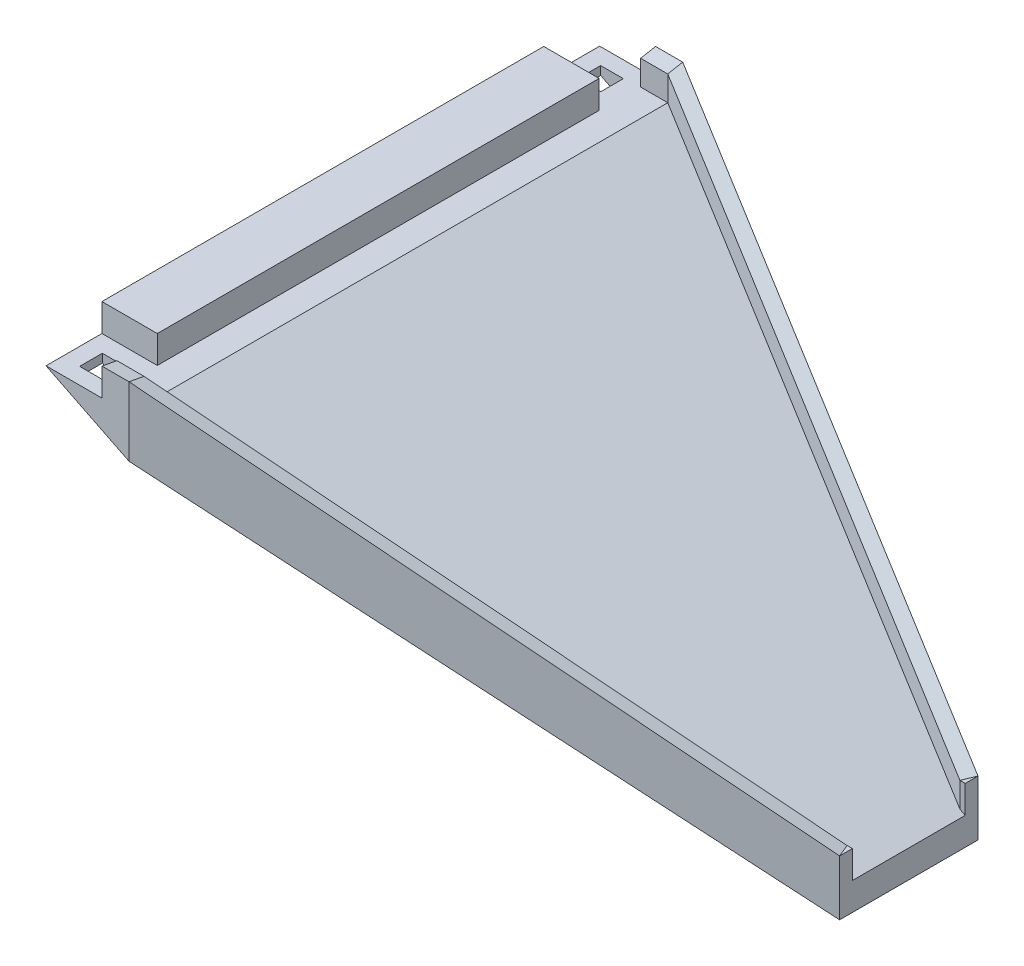
ISO-10303-21;
HEADER;
FILE_DESCRIPTION(('STEP AP214'),'2;1');
FILE_NAME('part.step','',(''),(''),'','','');
FILE_SCHEMA(('AUTOMOTIVE_DESIGN { 1 0 10303 214 1 1 1 1 }'));
ENDSEC;
DATA;
#1=APPLICATION_CONTEXT('core data for automotive mechanical design processes');
#2=APPLICATION_PROTOCOL_DEFINITION('international standard','automotive_design',2000,#1);
#3=PRODUCT_CONTEXT('',#1,'mechanical');
#4=PRODUCT('Part','Part','',(#3));
#5=PRODUCT_RELATED_PRODUCT_CATEGORY('part','',(#4));
#6=PRODUCT_DEFINITION_FORMATION('','',#4);
#7=PRODUCT_DEFINITION_CONTEXT('part definition',#1,'design');
#8=PRODUCT_DEFINITION('design','',#6,#7);
#9=PRODUCT_DEFINITION_SHAPE('','',#8);
#10=(LENGTH_UNIT() NAMED_UNIT(*) SI_UNIT(.MILLI.,.METRE.));
#11=(NAMED_UNIT(*) PLANE_ANGLE_UNIT() SI_UNIT($,.RADIAN.));
#12=(NAMED_UNIT(*) SI_UNIT($,.STERADIAN.) SOLID_ANGLE_UNIT());
#13=UNCERTAINTY_MEASURE_WITH_UNIT(LENGTH_MEASURE(1.E-05),#10,'distance_accuracy_value','');
#14=(GEOMETRIC_REPRESENTATION_CONTEXT(3) GLOBAL_UNCERTAINTY_ASSIGNED_CONTEXT((#13)) GLOBAL_UNIT_ASSIGNED_CONTEXT((#10,
#11,#12)) REPRESENTATION_CONTEXT('',''));
#15=CARTESIAN_POINT('',(0.,0.,0.));
#16=DIRECTION('',(0.,0.,1.));
#17=DIRECTION('',(1.,0.,0.));
#18=AXIS2_PLACEMENT_3D('',#15,#16,#17);
#19=CARTESIAN_POINT('',(34.2730049033685,100.,200.));
#20=DIRECTION('',(0.,-1.,0.));
#21=DIRECTION('',(0.,0.,-1.));
#22=AXIS2_PLACEMENT_3D('',#19,#20,#21);
#23=PLANE('',#22);
#24=DIRECTION('',(0.,0.,1.));
#25=VECTOR('',#24,1.);
#26=CARTESIAN_POINT('',(18.7230049033685,100.,185.9));
#27=LINE('',#26,#25);
#28=CARTESIAN_POINT('',(18.7230049033685,100.,185.9));
#29=VERTEX_POINT('',#28);
#30=CARTESIAN_POINT('',(18.7230049033685,100.,194.1));
#31=VERTEX_POINT('',#30);
#32=EDGE_CURVE('E264',#29,#31,#27,.T.);
#33=ORIENTED_EDGE('',*,*,#32,.T.);
#34=DIRECTION('',(-1.,0.,0.));
#35=VECTOR('',#34,1.);
#36=CARTESIAN_POINT('',(10.5230049033685,100.,194.1));
#37=LINE('',#36,#35);
#38=CARTESIAN_POINT('',(10.5230049033685,100.,194.1));
#39=VERTEX_POINT('',#38);
#40=EDGE_CURVE('E290',#31,#39,#37,.T.);
#41=ORIENTED_EDGE('',*,*,#40,.T.);
#42=DIRECTION('',(0.,0.,-1.));
#43=VECTOR('',#42,1.);
#44=CARTESIAN_POINT('',(10.5230049033685,100.,185.9));
#45=LINE('',#44,#43);
#46=CARTESIAN_POINT('',(10.5230049033685,100.,185.9));
#47=VERTEX_POINT('',#46);
#48=EDGE_CURVE('E287',#39,#47,#45,.T.);
#49=ORIENTED_EDGE('',*,*,#48,.T.);
#50=DIRECTION('',(1.,0.,0.));
#51=VECTOR('',#50,1.);
#52=CARTESIAN_POINT('',(10.5230049033685,100.,185.9));
#53=LINE('',#52,#51);
#54=EDGE_CURVE('E284',#47,#29,#53,.T.);
#55=ORIENTED_EDGE('',*,*,#54,.T.);
#56=EDGE_LOOP('',(#33,#41,#49,#55));
#57=FACE_BOUND('',#56,.T.);
#58=DIRECTION('',(-1.,0.,0.));
#59=VECTOR('',#58,1.);
#60=CARTESIAN_POINT('',(10.5230049033685,100.,5.9));
#61=LINE('',#60,#59);
#62=CARTESIAN_POINT('',(18.7230049033685,100.,5.89999999999999));
#63=VERTEX_POINT('',#62);
#64=CARTESIAN_POINT('',(10.5230049033685,100.,5.9));
#65=VERTEX_POINT('',#64);
#66=EDGE_CURVE('E379',#63,#65,#61,.T.);
#67=ORIENTED_EDGE('',*,*,#66,.F.);
#68=DIRECTION('',(0.,0.,-1.));
#69=VECTOR('',#68,1.);
#70=CARTESIAN_POINT('',(18.7230049033685,100.,14.1));
#71=LINE('',#70,#69);
#72=CARTESIAN_POINT('',(18.7230049033685,100.,14.1));
#73=VERTEX_POINT('',#72);
#74=EDGE_CURVE('E377',#73,#63,#71,.T.);
#75=ORIENTED_EDGE('',*,*,#74,.F.);
#76=DIRECTION('',(1.,0.,0.));
#77=VECTOR('',#76,1.);
#78=CARTESIAN_POINT('',(10.5230049033685,100.,14.1));
#79=LINE('',#78,#77);
#80=CARTESIAN_POINT('',(10.5230049033685,100.,14.1));
#81=VERTEX_POINT('',#80);
#82=EDGE_CURVE('E385',#81,#73,#79,.T.);
#83=ORIENTED_EDGE('',*,*,#82,.F.);
#84=DIRECTION('',(0.,0.,1.));
#85=VECTOR('',#84,1.);
#86=CARTESIAN_POINT('',(10.5230049033685,100.,14.1));
#87=LINE('',#86,#85);
#88=EDGE_CURVE('E382',#65,#81,#87,.T.);
#89=ORIENTED_EDGE('',*,*,#88,.F.);
#90=EDGE_LOOP('',(#67,#75,#83,#89));
#91=FACE_BOUND('',#90,.T.);
#92=DIRECTION('',(-1.,0.,0.));
#93=VECTOR('',#92,1.);
#94=CARTESIAN_POINT('',(215.934026149218,100.,5.40937737973224));
#95=LINE('',#94,#93);
#96=CARTESIAN_POINT('',(34.2730049033685,100.,5.40937737973257));
#97=VERTEX_POINT('',#96);
#98=CARTESIAN_POINT('',(24.4730049033669,100.,5.4093773797326));
#99=VERTEX_POINT('',#98);
#100=EDGE_CURVE('E53',#97,#99,#95,.T.);
#101=ORIENTED_EDGE('',*,*,#100,.T.);
#102=DIRECTION('',(0.,0.,-1.));
#103=VECTOR('',#102,1.);
#104=CARTESIAN_POINT('',(24.4730049033669,100.,5.4093773797326));
#105=LINE('',#104,#103);
#106=CARTESIAN_POINT('',(24.4730049033669,100.,0.));
#107=VERTEX_POINT('',#106);
#108=EDGE_CURVE('E58',#99,#107,#105,.T.);
#109=ORIENTED_EDGE('',*,*,#108,.T.);
#110=DIRECTION('',(-1.,0.,0.));
#111=VECTOR('',#110,1.);
#112=CARTESIAN_POINT('',(34.2730049033685,100.,0.));
#113=LINE('',#112,#111);
#114=CARTESIAN_POINT('',(4.27300490336853,100.,0.));
#115=VERTEX_POINT('',#114);
#116=EDGE_CURVE('E391',#107,#115,#113,.T.);
#117=ORIENTED_EDGE('',*,*,#116,.T.);
#118=DIRECTION('',(0.,0.,-1.));
#119=VECTOR('',#118,1.);
#120=CARTESIAN_POINT('',(4.27300490336853,100.,200.));
#121=LINE('',#120,#119);
#122=CARTESIAN_POINT('',(4.27300490336853,100.,20.2));
#123=VERTEX_POINT('',#122);
#124=EDGE_CURVE('E414',#123,#115,#121,.T.);
#125=ORIENTED_EDGE('',*,*,#124,.F.);
#126=DIRECTION('',(-1.,0.,0.));
#127=VECTOR('',#126,1.);
#128=CARTESIAN_POINT('',(4.27300490336853,100.,20.2));
#129=LINE('',#128,#127);
#130=CARTESIAN_POINT('',(24.2730049033685,100.,20.2));
#131=VERTEX_POINT('',#130);
#132=EDGE_CURVE('E310',#131,#123,#129,.T.);
#133=ORIENTED_EDGE('',*,*,#132,.F.);
#134=DIRECTION('',(0.,0.,-1.));
#135=VECTOR('',#134,1.);
#136=CARTESIAN_POINT('',(24.2730049033685,100.,20.2));
#137=LINE('',#136,#135);
#138=CARTESIAN_POINT('',(24.2730049033686,100.,179.8));
#139=VERTEX_POINT('',#138);
#140=EDGE_CURVE('E321',#139,#131,#137,.T.);
#141=ORIENTED_EDGE('',*,*,#140,.F.);
#142=DIRECTION('',(1.,0.,0.));
#143=VECTOR('',#142,1.);
#144=CARTESIAN_POINT('',(4.27300490336855,100.,179.8));
#145=LINE('',#144,#143);
#146=CARTESIAN_POINT('',(4.27300490336855,100.,179.8));
#147=VERTEX_POINT('',#146);
#148=EDGE_CURVE('E319',#147,#139,#145,.T.);
#149=ORIENTED_EDGE('',*,*,#148,.F.);
#150=CARTESIAN_POINT('',(4.27300490336853,100.,200.));
#151=VERTEX_POINT('',#150);
#152=EDGE_CURVE('E415',#151,#147,#121,.T.);
#153=ORIENTED_EDGE('',*,*,#152,.F.);
#154=DIRECTION('',(-1.,0.,0.));
#155=VECTOR('',#154,1.);
#156=CARTESIAN_POINT('',(34.2730049033685,100.,200.));
#157=LINE('',#156,#155);
#158=CARTESIAN_POINT('',(24.4730049033669,100.,200.));
#159=VERTEX_POINT('',#158);
#160=EDGE_CURVE('E398',#159,#151,#157,.T.);
#161=ORIENTED_EDGE('',*,*,#160,.F.);
#162=DIRECTION('',(0.,0.,1.));
#163=VECTOR('',#162,1.);
#164=CARTESIAN_POINT('',(24.4730049033669,100.,194.590622620267));
#165=LINE('',#164,#163);
#166=CARTESIAN_POINT('',(24.4730049033669,100.,194.590622620267));
#167=VERTEX_POINT('',#166);
#168=EDGE_CURVE('E269',#167,#159,#165,.T.);
#169=ORIENTED_EDGE('',*,*,#168,.F.);
#170=DIRECTION('',(-1.,0.,0.));
#171=VECTOR('',#170,1.);
#172=CARTESIAN_POINT('',(215.934026149218,100.,194.590622620268));
#173=LINE('',#172,#171);
#174=CARTESIAN_POINT('',(34.2730049033685,100.,194.590622620267));
#175=VERTEX_POINT('',#174);
#176=EDGE_CURVE('E277',#175,#167,#173,.T.);
#177=ORIENTED_EDGE('',*,*,#176,.F.);
#178=DIRECTION('',(0.,0.,-1.));
#179=VECTOR('',#178,1.);
#180=CARTESIAN_POINT('',(34.2730049033685,100.,200.));
#181=LINE('',#180,#179);
#182=EDGE_CURVE('E404',#175,#97,#181,.T.);
#183=ORIENTED_EDGE('',*,*,#182,.T.);
#184=EDGE_LOOP('',(#101,#109,#117,#125,#133,#141,#149,#153,#161,#169,#177,#183));
#185=FACE_BOUND('',#184,.T.);
#186=ADVANCED_FACE('F39',(#57,#91,#185),#23,.F.);
#187=CARTESIAN_POINT('',(4.27300490336853,100.,200.));
#188=DIRECTION('',(0.444402729352049,0.895827111748941,0.));
#189=DIRECTION('',(-0.895827111748941,0.444402729352049,0.));
#190=AXIS2_PLACEMENT_3D('',#187,#188,#189);
#191=PLANE('',#190);
#192=DIRECTION('',(0.,0.,-1.));
#193=VECTOR('',#192,1.);
#194=CARTESIAN_POINT('',(215.932026149218,-4.99999999999999,200.));
#195=LINE('',#194,#193);
#196=CARTESIAN_POINT('',(215.932026149218,-4.99999999999999,125.));
#197=VERTEX_POINT('',#196);
#198=CARTESIAN_POINT('',(215.932026149218,-4.99999999999999,75.));
#199=VERTEX_POINT('',#198);
#200=EDGE_CURVE('E411',#197,#199,#195,.T.);
#201=ORIENTED_EDGE('',*,*,#200,.F.);
#202=DIRECTION('',(-0.840202405908233,0.416808374625773,0.346887151603858));
#203=VECTOR('',#202,1.);
#204=CARTESIAN_POINT('',(7.88292578180368,98.2091871633696,210.895445326873));
#205=LINE('',#204,#203);
#206=CARTESIAN_POINT('',(34.2730049033685,85.117572681482,200.));
#207=VERTEX_POINT('',#206);
#208=EDGE_CURVE('E374',#197,#207,#205,.T.);
#209=ORIENTED_EDGE('',*,*,#208,.T.);
#210=DIRECTION('',(0.895827111748941,-0.444402729352049,0.));
#211=VECTOR('',#210,1.);
#212=CARTESIAN_POINT('',(4.27300490336853,100.,200.));
#213=LINE('',#212,#211);
#214=EDGE_CURVE('E400',#151,#207,#213,.T.);
#215=ORIENTED_EDGE('',*,*,#214,.F.);
#216=ORIENTED_EDGE('',*,*,#152,.T.);
#217=DIRECTION('',(0.,0.,1.));
#218=VECTOR('',#217,1.);
#219=CARTESIAN_POINT('',(4.27300490336853,100.,20.2));
#220=LINE('',#219,#218);
#221=EDGE_CURVE('E305',#123,#147,#220,.T.);
#222=ORIENTED_EDGE('',*,*,#221,.F.);
#223=ORIENTED_EDGE('',*,*,#124,.T.);
#224=DIRECTION('',(0.895827111748941,-0.444402729352049,0.));
#225=VECTOR('',#224,1.);
#226=CARTESIAN_POINT('',(4.27300490336853,100.,0.));
#227=LINE('',#226,#225);
#228=CARTESIAN_POINT('',(34.2730049033685,85.1175726814821,0.));
#229=VERTEX_POINT('',#228);
#230=EDGE_CURVE('E401',#115,#229,#227,.T.);
#231=ORIENTED_EDGE('',*,*,#230,.T.);
#232=DIRECTION('',(0.840202405908233,-0.416808374625773,0.346887151603858));
#233=VECTOR('',#232,1.);
#234=CARTESIAN_POINT('',(66.1740096530468,69.292093195656,13.1706938626949));
#235=LINE('',#234,#233);
#236=EDGE_CURVE('E221',#229,#199,#235,.T.);
#237=ORIENTED_EDGE('',*,*,#236,.T.);
#238=EDGE_LOOP('',(#201,#209,#215,#216,#222,#223,#231,#237));
#239=FACE_BOUND('',#238,.T.);
#240=DIRECTION('',(0.895827111748941,-0.444402729352049,0.));
#241=VECTOR('',#240,1.);
#242=CARTESIAN_POINT('',(4.2730049033685,100.,14.1));
#243=LINE('',#242,#241);
#244=CARTESIAN_POINT('',(10.5230049033685,96.8994943086421,14.1));
#245=VERTEX_POINT('',#244);
#246=CARTESIAN_POINT('',(18.7230049033685,92.8316308415805,14.1));
#247=VERTEX_POINT('',#246);
#248=EDGE_CURVE('E424',#245,#247,#243,.T.);
#249=ORIENTED_EDGE('',*,*,#248,.T.);
#250=DIRECTION('',(0.,0.,-1.));
#251=VECTOR('',#250,1.);
#252=CARTESIAN_POINT('',(18.7230049033684,92.8316308415806,200.));
#253=LINE('',#252,#251);
#254=CARTESIAN_POINT('',(18.7230049033685,92.8316308415805,5.9));
#255=VERTEX_POINT('',#254);
#256=EDGE_CURVE('E227',#247,#255,#253,.T.);
#257=ORIENTED_EDGE('',*,*,#256,.T.);
#258=DIRECTION('',(-0.895827111748941,0.444402729352049,0.));
#259=VECTOR('',#258,1.);
#260=CARTESIAN_POINT('',(4.27300490336853,100.,5.89999999999999));
#261=LINE('',#260,#259);
#262=CARTESIAN_POINT('',(10.5230049033685,96.8994943086421,5.89999999999999));
#263=VERTEX_POINT('',#262);
#264=EDGE_CURVE('E418',#255,#263,#261,.T.);
#265=ORIENTED_EDGE('',*,*,#264,.T.);
#266=DIRECTION('',(0.,0.,1.));
#267=VECTOR('',#266,1.);
#268=CARTESIAN_POINT('',(10.5230049033685,96.8994943086421,200.));
#269=LINE('',#268,#267);
#270=EDGE_CURVE('E421',#263,#245,#269,.T.);
#271=ORIENTED_EDGE('',*,*,#270,.T.);
#272=EDGE_LOOP('',(#249,#257,#265,#271));
#273=FACE_BOUND('',#272,.T.);
#274=DIRECTION('',(0.,0.,1.));
#275=VECTOR('',#274,1.);
#276=CARTESIAN_POINT('',(18.7230049033685,92.8316308415805,200.));
#277=LINE('',#276,#275);
#278=CARTESIAN_POINT('',(18.7230049033685,92.8316308415805,185.9));
#279=VERTEX_POINT('',#278);
#280=CARTESIAN_POINT('',(18.7230049033685,92.8316308415805,194.1));
#281=VERTEX_POINT('',#280);
#282=EDGE_CURVE('E11',#279,#281,#277,.T.);
#283=ORIENTED_EDGE('',*,*,#282,.F.);
#284=DIRECTION('',(0.895827111748941,-0.444402729352049,0.));
#285=VECTOR('',#284,1.);
#286=CARTESIAN_POINT('',(4.27300490336853,100.,185.9));
#287=LINE('',#286,#285);
#288=CARTESIAN_POINT('',(10.5230049033685,96.8994943086421,185.9));
#289=VERTEX_POINT('',#288);
#290=EDGE_CURVE('E438',#289,#279,#287,.T.);
#291=ORIENTED_EDGE('',*,*,#290,.F.);
#292=DIRECTION('',(0.,0.,-1.));
#293=VECTOR('',#292,1.);
#294=CARTESIAN_POINT('',(10.5230049033685,96.8994943086421,200.));
#295=LINE('',#294,#293);
#296=CARTESIAN_POINT('',(10.5230049033685,96.8994943086421,194.1));
#297=VERTEX_POINT('',#296);
#298=EDGE_CURVE('E440',#297,#289,#295,.T.);
#299=ORIENTED_EDGE('',*,*,#298,.F.);
#300=DIRECTION('',(-0.895827111748941,0.444402729352049,0.));
#301=VECTOR('',#300,1.);
#302=CARTESIAN_POINT('',(4.27300490336853,100.,194.1));
#303=LINE('',#302,#301);
#304=EDGE_CURVE('E46',#281,#297,#303,.T.);
#305=ORIENTED_EDGE('',*,*,#304,.F.);
#306=EDGE_LOOP('',(#283,#291,#299,#305));
#307=FACE_BOUND('',#306,.T.);
#308=ADVANCED_FACE('F455',(#239,#273,#307),#191,.F.);
#309=CARTESIAN_POINT('',(3.08313236388538,0.,207.467717434598));
#310=DIRECTION('',(-0.381616388486088,0.,-0.924320794983449));
#311=DIRECTION('',(0.924320794983449,0.,-0.381616388486089));
#312=AXIS2_PLACEMENT_3D('',#309,#310,#311);
#313=PLANE('',#312);
#314=DIRECTION('',(0.832195795833113,-0.435203272933807,-0.343581531263532));
#315=VECTOR('',#314,1.);
#316=CARTESIAN_POINT('',(192.94080559236,17.0234378558362,129.082810401191));
#317=LINE('',#316,#315);
#318=CARTESIAN_POINT('',(214.023944206788,5.99784631276625,120.378396025083));
#319=VERTEX_POINT('',#318);
#320=EDGE_CURVE('E433',#175,#319,#317,.T.);
#321=ORIENTED_EDGE('',*,*,#320,.F.);
#322=DIRECTION('',(0.,-1.,0.));
#323=VECTOR('',#322,1.);
#324=CARTESIAN_POINT('',(34.2730049033685,110.,194.590622620267));
#325=LINE('',#324,#323);
#326=CARTESIAN_POINT('',(34.2730049033685,109.002153687234,194.590622620267));
#327=VERTEX_POINT('',#326);
#328=EDGE_CURVE('E247',#327,#175,#325,.T.);
#329=ORIENTED_EDGE('',*,*,#328,.F.);
#330=DIRECTION('',(0.832195795833113,-0.435203272933808,-0.343581531263532));
#331=VECTOR('',#330,1.);
#332=CARTESIAN_POINT('',(214.023944206788,15.,120.378396025083));
#333=LINE('',#332,#331);
#334=CARTESIAN_POINT('',(214.023944206788,15.,120.378396025083));
#335=VERTEX_POINT('',#334);
#336=EDGE_CURVE('E359',#327,#335,#333,.T.);
#337=ORIENTED_EDGE('',*,*,#336,.T.);
#338=DIRECTION('',(0.,-1.,0.));
#339=VECTOR('',#338,1.);
#340=CARTESIAN_POINT('',(214.023944206788,5.,120.378396025083));
#341=LINE('',#340,#339);
#342=EDGE_CURVE('E356',#335,#319,#341,.T.);
#343=ORIENTED_EDGE('',*,*,#342,.T.);
#344=EDGE_LOOP('',(#321,#329,#337,#343));
#345=FACE_BOUND('',#344,.T.);
#346=ADVANCED_FACE('F509',(#345),#313,.T.);
#347=CARTESIAN_POINT('',(214.023944206788,15.,120.378396025083));
#348=DIRECTION('',(-0.402267435217576,-0.900332222697656,0.166080701274325));
#349=DIRECTION('',(0.913011983071897,-0.407932738042833,0.));
#350=AXIS2_PLACEMENT_3D('',#347,#348,#349);
#351=PLANE('',#350);
#352=DIRECTION('',(0.,-0.181405431892611,-0.983408393944172));
#353=VECTOR('',#352,1.);
#354=CARTESIAN_POINT('',(34.2730049033679,92.6696008223421,106.050993931642));
#355=LINE('',#354,#353);
#356=CARTESIAN_POINT('',(34.2730049033685,110.,200.));
#357=VERTEX_POINT('',#356);
#358=EDGE_CURVE('E435',#357,#327,#355,.T.);
#359=ORIENTED_EDGE('',*,*,#358,.F.);
#360=DIRECTION('',(0.832195795833113,-0.435203272933808,-0.343581531263532));
#361=VECTOR('',#360,1.);
#362=CARTESIAN_POINT('',(215.932026149218,15.,125.));
#363=LINE('',#362,#361);
#364=CARTESIAN_POINT('',(215.932026149218,15.,125.));
#365=VERTEX_POINT('',#364);
#366=EDGE_CURVE('E355',#357,#365,#363,.T.);
#367=ORIENTED_EDGE('',*,*,#366,.T.);
#368=DIRECTION('',(0.381616388486088,0.,0.924320794983449));
#369=VECTOR('',#368,1.);
#370=CARTESIAN_POINT('',(214.023944206788,15.,120.378396025083));
#371=LINE('',#370,#369);
#372=EDGE_CURVE('E238',#335,#365,#371,.T.);
#373=ORIENTED_EDGE('',*,*,#372,.F.);
#374=ORIENTED_EDGE('',*,*,#336,.F.);
#375=EDGE_LOOP('',(#359,#367,#373,#374));
#376=FACE_BOUND('',#375,.T.);
#377=ADVANCED_FACE('F504',(#376),#351,.F.);
#378=CARTESIAN_POINT('',(215.932026149218,5.,200.));
#379=DIRECTION('',(-0.463414634146341,-0.886141567052924,0.));
#380=DIRECTION('',(0.886141567052925,-0.463414634146342,0.));
#381=AXIS2_PLACEMENT_3D('',#378,#379,#380);
#382=PLANE('',#381);
#383=DIRECTION('',(0.,0.,-1.));
#384=VECTOR('',#383,1.);
#385=CARTESIAN_POINT('',(215.932026149218,5.,200.));
#386=LINE('',#385,#384);
#387=CARTESIAN_POINT('',(215.932026149218,5.,120.378396025083));
#388=VERTEX_POINT('',#387);
#389=CARTESIAN_POINT('',(215.932026149218,5.,79.6216039749172));
#390=VERTEX_POINT('',#389);
#391=EDGE_CURVE('E408',#388,#390,#386,.T.);
#392=ORIENTED_EDGE('',*,*,#391,.T.);
#393=DIRECTION('',(0.886141567052925,-0.463414634146342,0.));
#394=VECTOR('',#393,1.);
#395=CARTESIAN_POINT('',(45.6193605621486,94.0663349378872,79.6216039749172));
#396=LINE('',#395,#394);
#397=CARTESIAN_POINT('',(214.023944206788,5.99784631276597,79.6216039749173));
#398=VERTEX_POINT('',#397);
#399=EDGE_CURVE('E335',#398,#390,#396,.T.);
#400=ORIENTED_EDGE('',*,*,#399,.F.);
#401=DIRECTION('',(-0.832195795833113,0.435203272933807,-0.343581531263532));
#402=VECTOR('',#401,1.);
#403=CARTESIAN_POINT('',(250.126226761043,-12.8821235292635,94.5268433238881));
#404=LINE('',#403,#402);
#405=EDGE_CURVE('E430',#398,#97,#404,.T.);
#406=ORIENTED_EDGE('',*,*,#405,.T.);
#407=ORIENTED_EDGE('',*,*,#182,.F.);
#408=ORIENTED_EDGE('',*,*,#320,.T.);
#409=DIRECTION('',(-0.886141567052925,0.463414634146342,0.));
#410=VECTOR('',#409,1.);
#411=CARTESIAN_POINT('',(49.7258702631256,91.9188037064773,120.378396025083));
#412=LINE('',#411,#410);
#413=EDGE_CURVE('E352',#388,#319,#412,.T.);
#414=ORIENTED_EDGE('',*,*,#413,.F.);
#415=EDGE_LOOP('',(#392,#400,#406,#407,#408,#414));
#416=FACE_BOUND('',#415,.T.);
#417=ADVANCED_FACE('F501',(#416),#382,.F.);
#418=CARTESIAN_POINT('',(215.932026149218,-4.99999999999999,200.));
#419=DIRECTION('',(-1.,0.,0.));
#420=DIRECTION('',(0.,0.,1.));
#421=AXIS2_PLACEMENT_3D('',#418,#419,#420);
#422=PLANE('',#421);
#423=ORIENTED_EDGE('',*,*,#391,.F.);
#424=DIRECTION('',(0.,1.,0.));
#425=VECTOR('',#424,1.);
#426=CARTESIAN_POINT('',(215.932026149218,5.,120.378396025083));
#427=LINE('',#426,#425);
#428=CARTESIAN_POINT('',(215.932026149218,15.,120.378396025083));
#429=VERTEX_POINT('',#428);
#430=EDGE_CURVE('E345',#388,#429,#427,.T.);
#431=ORIENTED_EDGE('',*,*,#430,.T.);
#432=DIRECTION('',(0.,0.,1.));
#433=VECTOR('',#432,1.);
#434=CARTESIAN_POINT('',(215.932026149218,15.,125.));
#435=LINE('',#434,#433);
#436=EDGE_CURVE('E337',#429,#365,#435,.T.);
#437=ORIENTED_EDGE('',*,*,#436,.T.);
#438=DIRECTION('',(0.,1.,0.));
#439=VECTOR('',#438,1.);
#440=CARTESIAN_POINT('',(215.932026149218,-4.99999999999999,125.));
#441=LINE('',#440,#439);
#442=EDGE_CURVE('E370',#197,#365,#441,.T.);
#443=ORIENTED_EDGE('',*,*,#442,.F.);
#444=ORIENTED_EDGE('',*,*,#200,.T.);
#445=DIRECTION('',(0.,1.,0.));
#446=VECTOR('',#445,1.);
#447=CARTESIAN_POINT('',(215.932026149218,-4.99999999999999,75.));
#448=LINE('',#447,#446);
#449=CARTESIAN_POINT('',(215.932026149218,15.,75.));
#450=VERTEX_POINT('',#449);
#451=EDGE_CURVE('E369',#199,#450,#448,.T.);
#452=ORIENTED_EDGE('',*,*,#451,.T.);
#453=DIRECTION('',(0.,0.,1.));
#454=VECTOR('',#453,1.);
#455=CARTESIAN_POINT('',(215.932026149218,15.,79.6216039749172));
#456=LINE('',#455,#454);
#457=CARTESIAN_POINT('',(215.932026149218,15.,79.6216039749172));
#458=VERTEX_POINT('',#457);
#459=EDGE_CURVE('E340',#450,#458,#456,.T.);
#460=ORIENTED_EDGE('',*,*,#459,.T.);
#461=DIRECTION('',(0.,-1.,0.));
#462=VECTOR('',#461,1.);
#463=CARTESIAN_POINT('',(215.932026149218,15.,79.6216039749172));
#464=LINE('',#463,#462);
#465=EDGE_CURVE('E334',#458,#390,#464,.T.);
#466=ORIENTED_EDGE('',*,*,#465,.T.);
#467=EDGE_LOOP('',(#423,#431,#437,#443,#444,#452,#460,#466));
#468=FACE_BOUND('',#467,.T.);
#469=ADVANCED_FACE('F497',(#468),#422,.F.);
#470=CARTESIAN_POINT('',(0.,0.,200.));
#471=DIRECTION('',(0.,0.,-1.));
#472=DIRECTION('',(-1.,0.,0.));
#473=AXIS2_PLACEMENT_3D('',#470,#471,#472);
#474=PLANE('',#473);
#475=ORIENTED_EDGE('',*,*,#214,.T.);
#476=DIRECTION('',(0.,1.,0.));
#477=VECTOR('',#476,1.);
#478=CARTESIAN_POINT('',(34.2730049033686,0.,200.));
#479=LINE('',#478,#477);
#480=EDGE_CURVE('E226',#207,#357,#479,.T.);
#481=ORIENTED_EDGE('',*,*,#480,.T.);
#482=DIRECTION('',(-1.,0.,0.));
#483=VECTOR('',#482,1.);
#484=CARTESIAN_POINT('',(215.934026149218,110.,200.));
#485=LINE('',#484,#483);
#486=CARTESIAN_POINT('',(24.4730049033669,110.,200.));
#487=VERTEX_POINT('',#486);
#488=EDGE_CURVE('E270',#357,#487,#485,.T.);
#489=ORIENTED_EDGE('',*,*,#488,.T.);
#490=DIRECTION('',(0.,1.,0.));
#491=VECTOR('',#490,1.);
#492=CARTESIAN_POINT('',(24.4730049033669,100.,200.));
#493=LINE('',#492,#491);
#494=EDGE_CURVE('E266',#159,#487,#493,.T.);
#495=ORIENTED_EDGE('',*,*,#494,.F.);
#496=ORIENTED_EDGE('',*,*,#160,.T.);
#497=EDGE_LOOP('',(#475,#481,#489,#495,#496));
#498=FACE_BOUND('',#497,.T.);
#499=ADVANCED_FACE('F494',(#498),#474,.F.);
#500=CARTESIAN_POINT('',(0.,0.,0.));
#501=DIRECTION('',(0.,0.,-1.));
#502=DIRECTION('',(-1.,0.,0.));
#503=AXIS2_PLACEMENT_3D('',#500,#501,#502);
#504=PLANE('',#503);
#505=DIRECTION('',(0.,1.,0.));
#506=VECTOR('',#505,1.);
#507=CARTESIAN_POINT('',(34.2730049033685,0.,0.));
#508=LINE('',#507,#506);
#509=CARTESIAN_POINT('',(34.2730049033685,110.,2.3113553892628E-13));
#510=VERTEX_POINT('',#509);
#511=EDGE_CURVE('E216',#229,#510,#508,.T.);
#512=ORIENTED_EDGE('',*,*,#511,.F.);
#513=ORIENTED_EDGE('',*,*,#230,.F.);
#514=ORIENTED_EDGE('',*,*,#116,.F.);
#515=DIRECTION('',(0.,1.,0.));
#516=VECTOR('',#515,1.);
#517=CARTESIAN_POINT('',(24.4730049033669,100.,2.22044604925031E-13));
#518=LINE('',#517,#516);
#519=CARTESIAN_POINT('',(24.4730049033669,110.,2.4980018054066E-13));
#520=VERTEX_POINT('',#519);
#521=EDGE_CURVE('E252',#107,#520,#518,.T.);
#522=ORIENTED_EDGE('',*,*,#521,.T.);
#523=DIRECTION('',(-1.,0.,0.));
#524=VECTOR('',#523,1.);
#525=CARTESIAN_POINT('',(215.934026149218,110.,-1.14847915854897E-13));
#526=LINE('',#525,#524);
#527=EDGE_CURVE('E244',#510,#520,#526,.T.);
#528=ORIENTED_EDGE('',*,*,#527,.F.);
#529=EDGE_LOOP('',(#512,#513,#514,#522,#528));
#530=FACE_BOUND('',#529,.T.);
#531=ADVANCED_FACE('F250',(#530),#504,.T.);
#532=CARTESIAN_POINT('',(18.7230049033685,-100.,14.1));
#533=DIRECTION('',(1.,0.,0.));
#534=DIRECTION('',(0.,0.,-1.));
#535=AXIS2_PLACEMENT_3D('',#532,#533,#534);
#536=PLANE('',#535);
#537=DIRECTION('',(0.,1.,0.));
#538=VECTOR('',#537,1.);
#539=CARTESIAN_POINT('',(18.7230049033685,-100.,14.1));
#540=LINE('',#539,#538);
#541=EDGE_CURVE('E389',#247,#73,#540,.T.);
#542=ORIENTED_EDGE('',*,*,#541,.T.);
#543=ORIENTED_EDGE('',*,*,#74,.T.);
#544=DIRECTION('',(0.,1.,0.));
#545=VECTOR('',#544,1.);
#546=CARTESIAN_POINT('',(18.7230049033685,-100.,5.9));
#547=LINE('',#546,#545);
#548=EDGE_CURVE('E388',#255,#63,#547,.T.);
#549=ORIENTED_EDGE('',*,*,#548,.F.);
#550=ORIENTED_EDGE('',*,*,#256,.F.);
#551=EDGE_LOOP('',(#542,#543,#549,#550));
#552=FACE_BOUND('',#551,.T.);
#553=ADVANCED_FACE('F474',(#552),#536,.F.);
#554=CARTESIAN_POINT('',(10.5230049033685,-100.,14.1));
#555=DIRECTION('',(0.,0.,1.));
#556=DIRECTION('',(1.,0.,0.));
#557=AXIS2_PLACEMENT_3D('',#554,#555,#556);
#558=PLANE('',#557);
#559=DIRECTION('',(0.,1.,0.));
#560=VECTOR('',#559,1.);
#561=CARTESIAN_POINT('',(10.5230049033685,-100.,14.1));
#562=LINE('',#561,#560);
#563=EDGE_CURVE('E392',#245,#81,#562,.T.);
#564=ORIENTED_EDGE('',*,*,#563,.T.);
#565=ORIENTED_EDGE('',*,*,#82,.T.);
#566=ORIENTED_EDGE('',*,*,#541,.F.);
#567=ORIENTED_EDGE('',*,*,#248,.F.);
#568=EDGE_LOOP('',(#564,#565,#566,#567));
#569=FACE_BOUND('',#568,.T.);
#570=ADVANCED_FACE('F479',(#569),#558,.F.);
#571=CARTESIAN_POINT('',(10.5230049033685,-100.,14.1));
#572=DIRECTION('',(-1.,0.,0.));
#573=DIRECTION('',(0.,0.,1.));
#574=AXIS2_PLACEMENT_3D('',#571,#572,#573);
#575=PLANE('',#574);
#576=DIRECTION('',(0.,1.,0.));
#577=VECTOR('',#576,1.);
#578=CARTESIAN_POINT('',(10.5230049033685,-100.,5.9));
#579=LINE('',#578,#577);
#580=EDGE_CURVE('E394',#263,#65,#579,.T.);
#581=ORIENTED_EDGE('',*,*,#580,.T.);
#582=ORIENTED_EDGE('',*,*,#88,.T.);
#583=ORIENTED_EDGE('',*,*,#563,.F.);
#584=ORIENTED_EDGE('',*,*,#270,.F.);
#585=EDGE_LOOP('',(#581,#582,#583,#584));
#586=FACE_BOUND('',#585,.T.);
#587=ADVANCED_FACE('F481',(#586),#575,.F.);
#588=CARTESIAN_POINT('',(10.5230049033685,-100.,5.9));
#589=DIRECTION('',(0.,0.,-1.));
#590=DIRECTION('',(-1.,0.,0.));
#591=AXIS2_PLACEMENT_3D('',#588,#589,#590);
#592=PLANE('',#591);
#593=ORIENTED_EDGE('',*,*,#548,.T.);
#594=ORIENTED_EDGE('',*,*,#66,.T.);
#595=ORIENTED_EDGE('',*,*,#580,.F.);
#596=ORIENTED_EDGE('',*,*,#264,.F.);
#597=EDGE_LOOP('',(#593,#594,#595,#596));
#598=FACE_BOUND('',#597,.T.);
#599=ADVANCED_FACE('F470',(#598),#592,.F.);
#600=CARTESIAN_POINT('',(4.99121430631581,-4.99999999999999,-12.0893214095148));
#601=DIRECTION('',(-0.381616388486088,0.,0.924320794983449));
#602=DIRECTION('',(0.924320794983449,0.,0.381616388486088));
#603=AXIS2_PLACEMENT_3D('',#600,#601,#602);
#604=PLANE('',#603);
#605=ORIENTED_EDGE('',*,*,#511,.T.);
#606=DIRECTION('',(0.832195795833113,-0.435203272933808,0.343581531263532));
#607=VECTOR('',#606,1.);
#608=CARTESIAN_POINT('',(215.932026149218,15.,75.));
#609=LINE('',#608,#607);
#610=EDGE_CURVE('E219',#510,#450,#609,.T.);
#611=ORIENTED_EDGE('',*,*,#610,.T.);
#612=ORIENTED_EDGE('',*,*,#451,.F.);
#613=ORIENTED_EDGE('',*,*,#236,.F.);
#614=EDGE_LOOP('',(#605,#611,#612,#613));
#615=FACE_BOUND('',#614,.T.);
#616=ADVANCED_FACE('F218',(#615),#604,.F.);
#617=CARTESIAN_POINT('',(75.5384070231506,-4.99999999999999,182.963107817282));
#618=DIRECTION('',(-0.381616388486088,0.,-0.924320794983449));
#619=DIRECTION('',(-0.924320794983449,0.,0.381616388486088));
#620=AXIS2_PLACEMENT_3D('',#617,#618,#619);
#621=PLANE('',#620);
#622=ORIENTED_EDGE('',*,*,#442,.T.);
#623=ORIENTED_EDGE('',*,*,#366,.F.);
#624=ORIENTED_EDGE('',*,*,#480,.F.);
#625=ORIENTED_EDGE('',*,*,#208,.F.);
#626=EDGE_LOOP('',(#622,#623,#624,#625));
#627=FACE_BOUND('',#626,.T.);
#628=ADVANCED_FACE('F524',(#627),#621,.F.);
#629=CARTESIAN_POINT('',(3.08313236388538,0.,-7.4677174345976));
#630=DIRECTION('',(-0.381616388486088,0.,0.924320794983449));
#631=DIRECTION('',(0.924320794983449,0.,0.381616388486089));
#632=AXIS2_PLACEMENT_3D('',#629,#630,#631);
#633=PLANE('',#632);
#634=DIRECTION('',(0.,-1.,0.));
#635=VECTOR('',#634,1.);
#636=CARTESIAN_POINT('',(34.2730049033685,110.,5.40937737973257));
#637=LINE('',#636,#635);
#638=CARTESIAN_POINT('',(34.2730049033685,109.002153687234,5.40937737973257));
#639=VERTEX_POINT('',#638);
#640=EDGE_CURVE('E248',#639,#97,#637,.T.);
#641=ORIENTED_EDGE('',*,*,#640,.T.);
#642=ORIENTED_EDGE('',*,*,#405,.F.);
#643=DIRECTION('',(0.,-1.,0.));
#644=VECTOR('',#643,1.);
#645=CARTESIAN_POINT('',(214.023944206788,5.,79.6216039749172));
#646=LINE('',#645,#644);
#647=CARTESIAN_POINT('',(214.023944206788,15.,79.6216039749172));
#648=VERTEX_POINT('',#647);
#649=EDGE_CURVE('E366',#648,#398,#646,.T.);
#650=ORIENTED_EDGE('',*,*,#649,.F.);
#651=DIRECTION('',(0.832195795833113,-0.435203272933808,0.343581531263532));
#652=VECTOR('',#651,1.);
#653=CARTESIAN_POINT('',(214.023944206788,15.,79.6216039749172));
#654=LINE('',#653,#652);
#655=EDGE_CURVE('E237',#639,#648,#654,.T.);
#656=ORIENTED_EDGE('',*,*,#655,.F.);
#657=EDGE_LOOP('',(#641,#642,#650,#656));
#658=FACE_BOUND('',#657,.T.);
#659=ADVANCED_FACE('F580',(#658),#633,.T.);
#660=CARTESIAN_POINT('',(214.023944206788,15.,79.6216039749172));
#661=DIRECTION('',(0.402267435217576,0.900332222697656,0.166080701274325));
#662=DIRECTION('',(-0.913011983071897,0.407932738042833,0.));
#663=AXIS2_PLACEMENT_3D('',#660,#661,#662);
#664=PLANE('',#663);
#665=DIRECTION('',(0.,0.181405431892611,-0.983408393944172));
#666=VECTOR('',#665,1.);
#667=CARTESIAN_POINT('',(34.2730049033679,92.6696008223421,93.9490060683576));
#668=LINE('',#667,#666);
#669=EDGE_CURVE('E233',#639,#510,#668,.T.);
#670=ORIENTED_EDGE('',*,*,#669,.F.);
#671=ORIENTED_EDGE('',*,*,#655,.T.);
#672=DIRECTION('',(0.381616388486088,0.,-0.924320794983449));
#673=VECTOR('',#672,1.);
#674=CARTESIAN_POINT('',(214.023944206788,15.,79.6216039749172));
#675=LINE('',#674,#673);
#676=EDGE_CURVE('E236',#648,#450,#675,.T.);
#677=ORIENTED_EDGE('',*,*,#676,.T.);
#678=ORIENTED_EDGE('',*,*,#610,.F.);
#679=EDGE_LOOP('',(#670,#671,#677,#678));
#680=FACE_BOUND('',#679,.T.);
#681=ADVANCED_FACE('F232',(#680),#664,.T.);
#682=CARTESIAN_POINT('',(4.27100490336851,15.,125.));
#683=DIRECTION('',(0.,1.,0.));
#684=DIRECTION('',(0.,0.,1.));
#685=AXIS2_PLACEMENT_3D('',#682,#683,#684);
#686=PLANE('',#685);
#687=DIRECTION('',(1.,0.,0.));
#688=VECTOR('',#687,1.);
#689=CARTESIAN_POINT('',(4.27100490336851,15.,120.378396025083));
#690=LINE('',#689,#688);
#691=EDGE_CURVE('E348',#335,#429,#690,.T.);
#692=ORIENTED_EDGE('',*,*,#691,.F.);
#693=ORIENTED_EDGE('',*,*,#372,.T.);
#694=ORIENTED_EDGE('',*,*,#436,.F.);
#695=EDGE_LOOP('',(#692,#693,#694));
#696=FACE_BOUND('',#695,.T.);
#697=ADVANCED_FACE('F532',(#696),#686,.T.);
#698=CARTESIAN_POINT('',(4.27100490336851,5.,120.378396025083));
#699=DIRECTION('',(0.,0.,-1.));
#700=DIRECTION('',(-1.,0.,0.));
#701=AXIS2_PLACEMENT_3D('',#698,#699,#700);
#702=PLANE('',#701);
#703=ORIENTED_EDGE('',*,*,#413,.T.);
#704=ORIENTED_EDGE('',*,*,#342,.F.);
#705=ORIENTED_EDGE('',*,*,#691,.T.);
#706=ORIENTED_EDGE('',*,*,#430,.F.);
#707=EDGE_LOOP('',(#703,#704,#705,#706));
#708=FACE_BOUND('',#707,.T.);
#709=ADVANCED_FACE('F535',(#708),#702,.T.);
#710=CARTESIAN_POINT('',(4.27100490336851,15.,79.6216039749172));
#711=DIRECTION('',(0.,1.,0.));
#712=DIRECTION('',(0.,0.,1.));
#713=AXIS2_PLACEMENT_3D('',#710,#711,#712);
#714=PLANE('',#713);
#715=ORIENTED_EDGE('',*,*,#676,.F.);
#716=DIRECTION('',(1.,0.,0.));
#717=VECTOR('',#716,1.);
#718=CARTESIAN_POINT('',(4.27100490336851,15.,79.6216039749172));
#719=LINE('',#718,#717);
#720=EDGE_CURVE('E338',#648,#458,#719,.T.);
#721=ORIENTED_EDGE('',*,*,#720,.T.);
#722=ORIENTED_EDGE('',*,*,#459,.F.);
#723=EDGE_LOOP('',(#715,#721,#722));
#724=FACE_BOUND('',#723,.T.);
#725=ADVANCED_FACE('F589',(#724),#714,.T.);
#726=CARTESIAN_POINT('',(4.27100490336851,15.,79.6216039749172));
#727=DIRECTION('',(0.,0.,1.));
#728=DIRECTION('',(1.,0.,0.));
#729=AXIS2_PLACEMENT_3D('',#726,#727,#728);
#730=PLANE('',#729);
#731=ORIENTED_EDGE('',*,*,#649,.T.);
#732=ORIENTED_EDGE('',*,*,#399,.T.);
#733=ORIENTED_EDGE('',*,*,#465,.F.);
#734=ORIENTED_EDGE('',*,*,#720,.F.);
#735=EDGE_LOOP('',(#731,#732,#733,#734));
#736=FACE_BOUND('',#735,.T.);
#737=ADVANCED_FACE('F586',(#736),#730,.T.);
#738=CARTESIAN_POINT('',(4.27300490336853,110.,20.2));
#739=DIRECTION('',(1.,0.,0.));
#740=DIRECTION('',(0.,0.,-1.));
#741=AXIS2_PLACEMENT_3D('',#738,#739,#740);
#742=PLANE('',#741);
#743=ORIENTED_EDGE('',*,*,#221,.T.);
#744=DIRECTION('',(0.,-1.,0.));
#745=VECTOR('',#744,1.);
#746=CARTESIAN_POINT('',(4.27300490336855,110.,179.8));
#747=LINE('',#746,#745);
#748=CARTESIAN_POINT('',(4.27300490336855,110.,179.8));
#749=VERTEX_POINT('',#748);
#750=EDGE_CURVE('E332',#749,#147,#747,.T.);
#751=ORIENTED_EDGE('',*,*,#750,.F.);
#752=DIRECTION('',(0.,0.,1.));
#753=VECTOR('',#752,1.);
#754=CARTESIAN_POINT('',(4.27300490336853,110.,20.2));
#755=LINE('',#754,#753);
#756=CARTESIAN_POINT('',(4.27300490336853,110.,20.2));
#757=VERTEX_POINT('',#756);
#758=EDGE_CURVE('E306',#757,#749,#755,.T.);
#759=ORIENTED_EDGE('',*,*,#758,.F.);
#760=DIRECTION('',(0.,-1.,0.));
#761=VECTOR('',#760,1.);
#762=CARTESIAN_POINT('',(4.27300490336853,110.,20.2));
#763=LINE('',#762,#761);
#764=EDGE_CURVE('E316',#757,#123,#763,.T.);
#765=ORIENTED_EDGE('',*,*,#764,.T.);
#766=EDGE_LOOP('',(#743,#751,#759,#765));
#767=FACE_BOUND('',#766,.T.);
#768=ADVANCED_FACE('F567',(#767),#742,.F.);
#769=CARTESIAN_POINT('',(4.27300490336855,110.,179.8));
#770=DIRECTION('',(0.,0.,-1.));
#771=DIRECTION('',(-1.,0.,0.));
#772=AXIS2_PLACEMENT_3D('',#769,#770,#771);
#773=PLANE('',#772);
#774=ORIENTED_EDGE('',*,*,#148,.T.);
#775=DIRECTION('',(0.,-1.,0.));
#776=VECTOR('',#775,1.);
#777=CARTESIAN_POINT('',(24.2730049033686,110.,179.8));
#778=LINE('',#777,#776);
#779=CARTESIAN_POINT('',(24.2730049033686,110.,179.8));
#780=VERTEX_POINT('',#779);
#781=EDGE_CURVE('E329',#780,#139,#778,.T.);
#782=ORIENTED_EDGE('',*,*,#781,.F.);
#783=DIRECTION('',(1.,0.,0.));
#784=VECTOR('',#783,1.);
#785=CARTESIAN_POINT('',(4.27300490336855,110.,179.8));
#786=LINE('',#785,#784);
#787=EDGE_CURVE('E309',#749,#780,#786,.T.);
#788=ORIENTED_EDGE('',*,*,#787,.F.);
#789=ORIENTED_EDGE('',*,*,#750,.T.);
#790=EDGE_LOOP('',(#774,#782,#788,#789));
#791=FACE_BOUND('',#790,.T.);
#792=ADVANCED_FACE('F555',(#791),#773,.F.);
#793=CARTESIAN_POINT('',(24.2730049033685,110.,20.2));
#794=DIRECTION('',(-1.,0.,0.));
#795=DIRECTION('',(0.,0.,1.));
#796=AXIS2_PLACEMENT_3D('',#793,#794,#795);
#797=PLANE('',#796);
#798=ORIENTED_EDGE('',*,*,#140,.T.);
#799=DIRECTION('',(0.,-1.,0.));
#800=VECTOR('',#799,1.);
#801=CARTESIAN_POINT('',(24.2730049033685,110.,20.2));
#802=LINE('',#801,#800);
#803=CARTESIAN_POINT('',(24.2730049033685,110.,20.2));
#804=VERTEX_POINT('',#803);
#805=EDGE_CURVE('E326',#804,#131,#802,.T.);
#806=ORIENTED_EDGE('',*,*,#805,.F.);
#807=DIRECTION('',(0.,0.,-1.));
#808=VECTOR('',#807,1.);
#809=CARTESIAN_POINT('',(24.2730049033685,110.,20.2));
#810=LINE('',#809,#808);
#811=EDGE_CURVE('E312',#780,#804,#810,.T.);
#812=ORIENTED_EDGE('',*,*,#811,.F.);
#813=ORIENTED_EDGE('',*,*,#781,.T.);
#814=EDGE_LOOP('',(#798,#806,#812,#813));
#815=FACE_BOUND('',#814,.T.);
#816=ADVANCED_FACE('F559',(#815),#797,.F.);
#817=CARTESIAN_POINT('',(4.27300490336853,110.,20.2));
#818=DIRECTION('',(0.,0.,1.));
#819=DIRECTION('',(1.,0.,0.));
#820=AXIS2_PLACEMENT_3D('',#817,#818,#819);
#821=PLANE('',#820);
#822=ORIENTED_EDGE('',*,*,#132,.T.);
#823=ORIENTED_EDGE('',*,*,#764,.F.);
#824=DIRECTION('',(-1.,0.,0.));
#825=VECTOR('',#824,1.);
#826=CARTESIAN_POINT('',(4.27300490336853,110.,20.2));
#827=LINE('',#826,#825);
#828=EDGE_CURVE('E314',#804,#757,#827,.T.);
#829=ORIENTED_EDGE('',*,*,#828,.F.);
#830=ORIENTED_EDGE('',*,*,#805,.T.);
#831=EDGE_LOOP('',(#822,#823,#829,#830));
#832=FACE_BOUND('',#831,.T.);
#833=ADVANCED_FACE('F607',(#832),#821,.F.);
#834=CARTESIAN_POINT('',(0.,110.,0.));
#835=DIRECTION('',(0.,1.,0.));
#836=DIRECTION('',(0.,0.,1.));
#837=AXIS2_PLACEMENT_3D('',#834,#835,#836);
#838=PLANE('',#837);
#839=ORIENTED_EDGE('',*,*,#758,.T.);
#840=ORIENTED_EDGE('',*,*,#787,.T.);
#841=ORIENTED_EDGE('',*,*,#811,.T.);
#842=ORIENTED_EDGE('',*,*,#828,.T.);
#843=EDGE_LOOP('',(#839,#840,#841,#842));
#844=FACE_BOUND('',#843,.T.);
#845=ADVANCED_FACE('F563',(#844),#838,.T.);
#846=CARTESIAN_POINT('',(18.7230049033685,-100.,185.9));
#847=DIRECTION('',(-1.,0.,0.));
#848=DIRECTION('',(0.,0.,1.));
#849=AXIS2_PLACEMENT_3D('',#846,#847,#848);
#850=PLANE('',#849);
#851=ORIENTED_EDGE('',*,*,#282,.T.);
#852=DIRECTION('',(0.,1.,0.));
#853=VECTOR('',#852,1.);
#854=CARTESIAN_POINT('',(18.7230049033685,-100.,194.1));
#855=LINE('',#854,#853);
#856=EDGE_CURVE('E294',#281,#31,#855,.T.);
#857=ORIENTED_EDGE('',*,*,#856,.T.);
#858=ORIENTED_EDGE('',*,*,#32,.F.);
#859=DIRECTION('',(0.,1.,0.));
#860=VECTOR('',#859,1.);
#861=CARTESIAN_POINT('',(18.7230049033685,-100.,185.9));
#862=LINE('',#861,#860);
#863=EDGE_CURVE('E293',#279,#29,#862,.T.);
#864=ORIENTED_EDGE('',*,*,#863,.F.);
#865=EDGE_LOOP('',(#851,#857,#858,#864));
#866=FACE_BOUND('',#865,.T.);
#867=ADVANCED_FACE('F461',(#866),#850,.T.);
#868=CARTESIAN_POINT('',(10.5230049033685,-100.,194.1));
#869=DIRECTION('',(0.,0.,-1.));
#870=DIRECTION('',(-1.,0.,0.));
#871=AXIS2_PLACEMENT_3D('',#868,#869,#870);
#872=PLANE('',#871);
#873=ORIENTED_EDGE('',*,*,#304,.T.);
#874=DIRECTION('',(0.,1.,0.));
#875=VECTOR('',#874,1.);
#876=CARTESIAN_POINT('',(10.5230049033685,-100.,194.1));
#877=LINE('',#876,#875);
#878=EDGE_CURVE('E296',#297,#39,#877,.T.);
#879=ORIENTED_EDGE('',*,*,#878,.T.);
#880=ORIENTED_EDGE('',*,*,#40,.F.);
#881=ORIENTED_EDGE('',*,*,#856,.F.);
#882=EDGE_LOOP('',(#873,#879,#880,#881));
#883=FACE_BOUND('',#882,.T.);
#884=ADVANCED_FACE('F446',(#883),#872,.T.);
#885=CARTESIAN_POINT('',(10.5230049033685,-100.,185.9));
#886=DIRECTION('',(1.,0.,0.));
#887=DIRECTION('',(0.,0.,-1.));
#888=AXIS2_PLACEMENT_3D('',#885,#886,#887);
#889=PLANE('',#888);
#890=ORIENTED_EDGE('',*,*,#298,.T.);
#891=DIRECTION('',(0.,1.,0.));
#892=VECTOR('',#891,1.);
#893=CARTESIAN_POINT('',(10.5230049033685,-100.,185.9));
#894=LINE('',#893,#892);
#895=EDGE_CURVE('E298',#289,#47,#894,.T.);
#896=ORIENTED_EDGE('',*,*,#895,.T.);
#897=ORIENTED_EDGE('',*,*,#48,.F.);
#898=ORIENTED_EDGE('',*,*,#878,.F.);
#899=EDGE_LOOP('',(#890,#896,#897,#898));
#900=FACE_BOUND('',#899,.T.);
#901=ADVANCED_FACE('F453',(#900),#889,.T.);
#902=CARTESIAN_POINT('',(10.5230049033685,-100.,185.9));
#903=DIRECTION('',(0.,0.,1.));
#904=DIRECTION('',(1.,0.,0.));
#905=AXIS2_PLACEMENT_3D('',#902,#903,#904);
#906=PLANE('',#905);
#907=ORIENTED_EDGE('',*,*,#290,.T.);
#908=ORIENTED_EDGE('',*,*,#863,.T.);
#909=ORIENTED_EDGE('',*,*,#54,.F.);
#910=ORIENTED_EDGE('',*,*,#895,.F.);
#911=EDGE_LOOP('',(#907,#908,#909,#910));
#912=FACE_BOUND('',#911,.T.);
#913=ADVANCED_FACE('F458',(#912),#906,.T.);
#914=CARTESIAN_POINT('',(215.934026149218,109.002153687234,194.590622620268));
#915=DIRECTION('',(0.,0.,-1.));
#916=DIRECTION('',(-1.,0.,0.));
#917=AXIS2_PLACEMENT_3D('',#914,#915,#916);
#918=PLANE('',#917);
#919=ORIENTED_EDGE('',*,*,#328,.T.);
#920=ORIENTED_EDGE('',*,*,#176,.T.);
#921=DIRECTION('',(0.,-1.,0.));
#922=VECTOR('',#921,1.);
#923=CARTESIAN_POINT('',(24.4730049033669,109.002153687234,194.590622620267));
#924=LINE('',#923,#922);
#925=CARTESIAN_POINT('',(24.4730049033669,109.002153687234,194.590622620267));
#926=VERTEX_POINT('',#925);
#927=EDGE_CURVE('E265',#926,#167,#924,.T.);
#928=ORIENTED_EDGE('',*,*,#927,.F.);
#929=DIRECTION('',(-1.,0.,0.));
#930=VECTOR('',#929,1.);
#931=CARTESIAN_POINT('',(215.934026149218,109.002153687234,194.590622620268));
#932=LINE('',#931,#930);
#933=EDGE_CURVE('E275',#327,#926,#932,.T.);
#934=ORIENTED_EDGE('',*,*,#933,.F.);
#935=EDGE_LOOP('',(#919,#920,#928,#934));
#936=FACE_BOUND('',#935,.T.);
#937=ADVANCED_FACE('F544',(#936),#918,.T.);
#938=CARTESIAN_POINT('',(215.934026149218,110.,200.));
#939=DIRECTION('',(0.,0.983408393944171,-0.181405431892613));
#940=DIRECTION('',(0.,0.181405431892613,0.983408393944171));
#941=AXIS2_PLACEMENT_3D('',#938,#939,#940);
#942=PLANE('',#941);
#943=ORIENTED_EDGE('',*,*,#358,.T.);
#944=ORIENTED_EDGE('',*,*,#933,.T.);
#945=DIRECTION('',(0.,-0.181405431892613,-0.983408393944171));
#946=VECTOR('',#945,1.);
#947=CARTESIAN_POINT('',(24.4730049033669,110.,200.));
#948=LINE('',#947,#946);
#949=EDGE_CURVE('E261',#487,#926,#948,.T.);
#950=ORIENTED_EDGE('',*,*,#949,.F.);
#951=ORIENTED_EDGE('',*,*,#488,.F.);
#952=EDGE_LOOP('',(#943,#944,#950,#951));
#953=FACE_BOUND('',#952,.T.);
#954=ADVANCED_FACE('F541',(#953),#942,.T.);
#955=CARTESIAN_POINT('',(24.4730049033672,0.,0.));
#956=DIRECTION('',(-1.,0.,0.));
#957=DIRECTION('',(0.,0.,1.));
#958=AXIS2_PLACEMENT_3D('',#955,#956,#957);
#959=PLANE('',#958);
#960=ORIENTED_EDGE('',*,*,#949,.T.);
#961=ORIENTED_EDGE('',*,*,#927,.T.);
#962=ORIENTED_EDGE('',*,*,#168,.T.);
#963=ORIENTED_EDGE('',*,*,#494,.T.);
#964=EDGE_LOOP('',(#960,#961,#962,#963));
#965=FACE_BOUND('',#964,.T.);
#966=ADVANCED_FACE('F546',(#965),#959,.T.);
#967=CARTESIAN_POINT('',(215.934026149218,109.002153687234,5.40937737973224));
#968=DIRECTION('',(0.,0.,-1.));
#969=DIRECTION('',(-1.,0.,0.));
#970=AXIS2_PLACEMENT_3D('',#967,#968,#969);
#971=PLANE('',#970);
#972=ORIENTED_EDGE('',*,*,#640,.F.);
#973=DIRECTION('',(-1.,0.,0.));
#974=VECTOR('',#973,1.);
#975=CARTESIAN_POINT('',(215.934026149218,109.002153687234,5.40937737973224));
#976=LINE('',#975,#974);
#977=CARTESIAN_POINT('',(24.4730049033669,109.002153687234,5.4093773797326));
#978=VERTEX_POINT('',#977);
#979=EDGE_CURVE('E246',#639,#978,#976,.T.);
#980=ORIENTED_EDGE('',*,*,#979,.T.);
#981=DIRECTION('',(0.,-1.,0.));
#982=VECTOR('',#981,1.);
#983=CARTESIAN_POINT('',(24.4730049033669,109.002153687234,5.4093773797326));
#984=LINE('',#983,#982);
#985=EDGE_CURVE('E257',#978,#99,#984,.T.);
#986=ORIENTED_EDGE('',*,*,#985,.T.);
#987=ORIENTED_EDGE('',*,*,#100,.F.);
#988=EDGE_LOOP('',(#972,#980,#986,#987));
#989=FACE_BOUND('',#988,.T.);
#990=ADVANCED_FACE('F577',(#989),#971,.F.);
#991=CARTESIAN_POINT('',(215.934026149218,110.,-1.14847915854897E-13));
#992=DIRECTION('',(0.,-0.983408393944171,-0.181405431892613));
#993=DIRECTION('',(0.,0.181405431892613,-0.983408393944171));
#994=AXIS2_PLACEMENT_3D('',#991,#992,#993);
#995=PLANE('',#994);
#996=ORIENTED_EDGE('',*,*,#669,.T.);
#997=ORIENTED_EDGE('',*,*,#527,.T.);
#998=DIRECTION('',(0.,-0.181405431892613,0.983408393944171));
#999=VECTOR('',#998,1.);
#1000=CARTESIAN_POINT('',(24.4730049033669,110.,2.4980018054066E-13));
#1001=LINE('',#1000,#999);
#1002=EDGE_CURVE('E278',#520,#978,#1001,.T.);
#1003=ORIENTED_EDGE('',*,*,#1002,.T.);
#1004=ORIENTED_EDGE('',*,*,#979,.F.);
#1005=EDGE_LOOP('',(#996,#997,#1003,#1004));
#1006=FACE_BOUND('',#1005,.T.);
#1007=ADVANCED_FACE('F242',(#1006),#995,.F.);
#1008=CARTESIAN_POINT('',(24.4730049033672,0.,200.));
#1009=DIRECTION('',(-1.,0.,0.));
#1010=DIRECTION('',(0.,0.,-1.));
#1011=AXIS2_PLACEMENT_3D('',#1008,#1009,#1010);
#1012=PLANE('',#1011);
#1013=ORIENTED_EDGE('',*,*,#1002,.F.);
#1014=ORIENTED_EDGE('',*,*,#521,.F.);
#1015=ORIENTED_EDGE('',*,*,#108,.F.);
#1016=ORIENTED_EDGE('',*,*,#985,.F.);
#1017=EDGE_LOOP('',(#1013,#1014,#1015,#1016));
#1018=FACE_BOUND('',#1017,.T.);
#1019=ADVANCED_FACE('F571',(#1018),#1012,.T.);
#1020=CLOSED_SHELL('',(#186,#308,#346,#377,#417,#469,#499,#531,#553,#570,#587,#599,#616,#628,
#659,#681,#697,#709,#725,#737,#768,#792,#816,#833,#845,#867,#884,#901,#913,#937,#954,#966,#990,
#1007,#1019));
#1021=MANIFOLD_SOLID_BREP('B2',#1020);
#1022=ADVANCED_BREP_SHAPE_REPRESENTATION('',(#18,#1021),#14);
#1023=SHAPE_DEFINITION_REPRESENTATION(#9,#1022);
ENDSEC;
END-ISO-10303-21;
